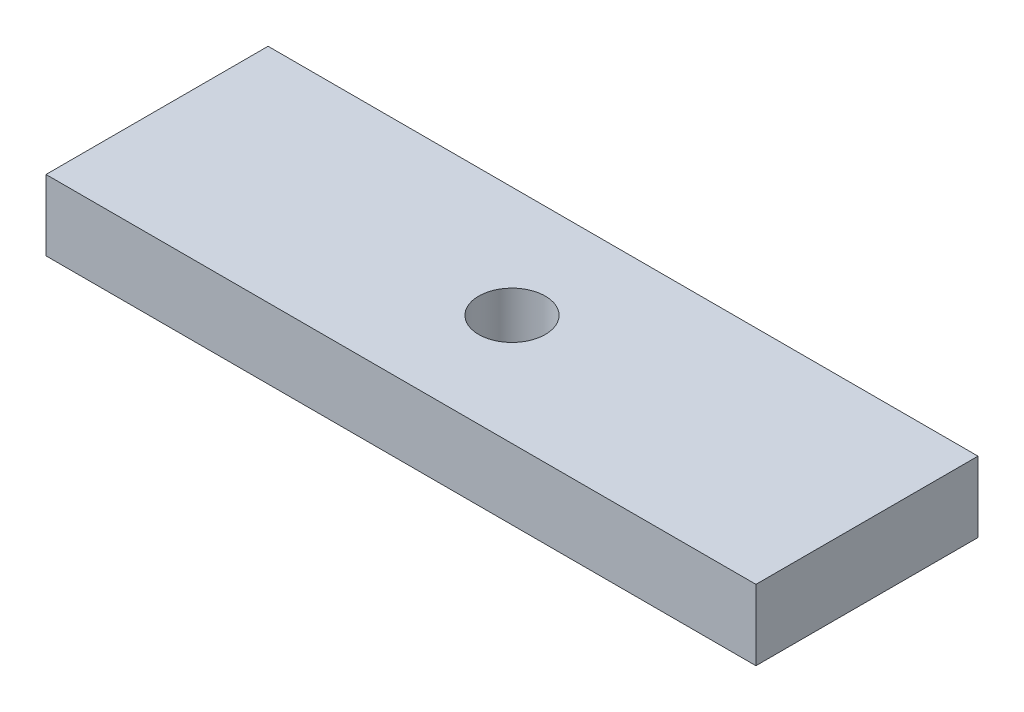
ISO-10303-21;
HEADER;
FILE_DESCRIPTION(('STEP AP214'),'2;1');
FILE_NAME('part.step','',(''),(''),'','','');
FILE_SCHEMA(('AUTOMOTIVE_DESIGN { 1 0 10303 214 1 1 1 1 }'));
ENDSEC;
DATA;
#1=APPLICATION_CONTEXT('core data for automotive mechanical design processes');
#2=APPLICATION_PROTOCOL_DEFINITION('international standard','automotive_design',2000,#1);
#3=PRODUCT_CONTEXT('',#1,'mechanical');
#4=PRODUCT('Part','Part','',(#3));
#5=PRODUCT_RELATED_PRODUCT_CATEGORY('part','',(#4));
#6=PRODUCT_DEFINITION_FORMATION('','',#4);
#7=PRODUCT_DEFINITION_CONTEXT('part definition',#1,'design');
#8=PRODUCT_DEFINITION('design','',#6,#7);
#9=PRODUCT_DEFINITION_SHAPE('','',#8);
#10=(LENGTH_UNIT() NAMED_UNIT(*) SI_UNIT(.MILLI.,.METRE.));
#11=(NAMED_UNIT(*) PLANE_ANGLE_UNIT() SI_UNIT($,.RADIAN.));
#12=(NAMED_UNIT(*) SI_UNIT($,.STERADIAN.) SOLID_ANGLE_UNIT());
#13=UNCERTAINTY_MEASURE_WITH_UNIT(LENGTH_MEASURE(1.E-05),#10,'distance_accuracy_value','');
#14=(GEOMETRIC_REPRESENTATION_CONTEXT(3) GLOBAL_UNCERTAINTY_ASSIGNED_CONTEXT((#13)) GLOBAL_UNIT_ASSIGNED_CONTEXT((#10,
#11,#12)) REPRESENTATION_CONTEXT('',''));
#15=CARTESIAN_POINT('',(0.,0.,0.));
#16=DIRECTION('',(0.,0.,1.));
#17=DIRECTION('',(1.,0.,0.));
#18=AXIS2_PLACEMENT_3D('',#15,#16,#17);
#19=CARTESIAN_POINT('',(0.,6.35,0.));
#20=DIRECTION('',(0.,1.,0.));
#21=DIRECTION('',(0.,0.,1.));
#22=AXIS2_PLACEMENT_3D('',#19,#20,#21);
#23=PLANE('',#22);
#24=DIRECTION('',(0.,0.,-1.));
#25=VECTOR('',#24,1.);
#26=CARTESIAN_POINT('',(31.97,6.35,-10.));
#27=LINE('',#26,#25);
#28=CARTESIAN_POINT('',(31.97,6.35,10.));
#29=VERTEX_POINT('',#28);
#30=CARTESIAN_POINT('',(31.97,6.35,-10.));
#31=VERTEX_POINT('',#30);
#32=EDGE_CURVE('E85',#29,#31,#27,.T.);
#33=ORIENTED_EDGE('',*,*,#32,.T.);
#34=DIRECTION('',(-1.,0.,0.));
#35=VECTOR('',#34,1.);
#36=CARTESIAN_POINT('',(-31.97,6.35,-10.));
#37=LINE('',#36,#35);
#38=CARTESIAN_POINT('',(-31.97,6.35,-10.));
#39=VERTEX_POINT('',#38);
#40=EDGE_CURVE('E80',#31,#39,#37,.T.);
#41=ORIENTED_EDGE('',*,*,#40,.T.);
#42=DIRECTION('',(0.,0.,1.));
#43=VECTOR('',#42,1.);
#44=CARTESIAN_POINT('',(-31.97,6.35,-10.));
#45=LINE('',#44,#43);
#46=CARTESIAN_POINT('',(-31.97,6.35,10.));
#47=VERTEX_POINT('',#46);
#48=EDGE_CURVE('E83',#39,#47,#45,.T.);
#49=ORIENTED_EDGE('',*,*,#48,.T.);
#50=DIRECTION('',(1.,0.,0.));
#51=VECTOR('',#50,1.);
#52=CARTESIAN_POINT('',(-31.97,6.35,10.));
#53=LINE('',#52,#51);
#54=EDGE_CURVE('E50',#47,#29,#53,.T.);
#55=ORIENTED_EDGE('',*,*,#54,.T.);
#56=EDGE_LOOP('',(#33,#41,#49,#55));
#57=FACE_BOUND('',#56,.T.);
#58=CARTESIAN_POINT('',(0.,6.35,0.));
#59=DIRECTION('',(0.,1.,0.));
#60=DIRECTION('',(0.,0.,1.));
#61=AXIS2_PLACEMENT_3D('',#58,#59,#60);
#62=CIRCLE('',#61,3.);
#63=CARTESIAN_POINT('',(0.,6.35,3.));
#64=VERTEX_POINT('',#63);
#65=EDGE_CURVE('E100',#64,#64,#62,.T.);
#66=ORIENTED_EDGE('',*,*,#65,.F.);
#67=EDGE_LOOP('',(#66));
#68=FACE_BOUND('',#67,.T.);
#69=ADVANCED_FACE('F33',(#57,#68),#23,.T.);
#70=CARTESIAN_POINT('',(0.,0.,0.));
#71=DIRECTION('',(0.,1.,0.));
#72=DIRECTION('',(0.,0.,1.));
#73=AXIS2_PLACEMENT_3D('',#70,#71,#72);
#74=PLANE('',#73);
#75=DIRECTION('',(0.,0.,-1.));
#76=VECTOR('',#75,1.);
#77=CARTESIAN_POINT('',(31.97,0.,-10.));
#78=LINE('',#77,#76);
#79=CARTESIAN_POINT('',(31.97,0.,10.));
#80=VERTEX_POINT('',#79);
#81=CARTESIAN_POINT('',(31.97,0.,-10.));
#82=VERTEX_POINT('',#81);
#83=EDGE_CURVE('E97',#80,#82,#78,.T.);
#84=ORIENTED_EDGE('',*,*,#83,.F.);
#85=DIRECTION('',(1.,0.,0.));
#86=VECTOR('',#85,1.);
#87=CARTESIAN_POINT('',(-31.97,0.,10.));
#88=LINE('',#87,#86);
#89=CARTESIAN_POINT('',(-31.97,0.,10.));
#90=VERTEX_POINT('',#89);
#91=EDGE_CURVE('E73',#90,#80,#88,.T.);
#92=ORIENTED_EDGE('',*,*,#91,.F.);
#93=DIRECTION('',(0.,0.,1.));
#94=VECTOR('',#93,1.);
#95=CARTESIAN_POINT('',(-31.97,0.,-10.));
#96=LINE('',#95,#94);
#97=CARTESIAN_POINT('',(-31.97,0.,-10.));
#98=VERTEX_POINT('',#97);
#99=EDGE_CURVE('E67',#98,#90,#96,.T.);
#100=ORIENTED_EDGE('',*,*,#99,.F.);
#101=DIRECTION('',(-1.,0.,0.));
#102=VECTOR('',#101,1.);
#103=CARTESIAN_POINT('',(-31.97,0.,-10.));
#104=LINE('',#103,#102);
#105=EDGE_CURVE('E89',#82,#98,#104,.T.);
#106=ORIENTED_EDGE('',*,*,#105,.F.);
#107=EDGE_LOOP('',(#84,#92,#100,#106));
#108=FACE_BOUND('',#107,.T.);
#109=CARTESIAN_POINT('',(0.,0.,0.));
#110=DIRECTION('',(0.,1.,0.));
#111=DIRECTION('',(0.,0.,1.));
#112=AXIS2_PLACEMENT_3D('',#109,#110,#111);
#113=CIRCLE('',#112,3.);
#114=CARTESIAN_POINT('',(0.,0.,3.));
#115=VERTEX_POINT('',#114);
#116=EDGE_CURVE('E112',#115,#115,#113,.T.);
#117=ORIENTED_EDGE('',*,*,#116,.T.);
#118=EDGE_LOOP('',(#117));
#119=FACE_BOUND('',#118,.T.);
#120=ADVANCED_FACE('F108',(#108,#119),#74,.F.);
#121=CARTESIAN_POINT('',(31.97,6.35,-10.));
#122=DIRECTION('',(-1.,0.,0.));
#123=DIRECTION('',(0.,0.,1.));
#124=AXIS2_PLACEMENT_3D('',#121,#122,#123);
#125=PLANE('',#124);
#126=ORIENTED_EDGE('',*,*,#83,.T.);
#127=DIRECTION('',(0.,-1.,0.));
#128=VECTOR('',#127,1.);
#129=CARTESIAN_POINT('',(31.97,6.35,-10.));
#130=LINE('',#129,#128);
#131=EDGE_CURVE('E11',#31,#82,#130,.T.);
#132=ORIENTED_EDGE('',*,*,#131,.F.);
#133=ORIENTED_EDGE('',*,*,#32,.F.);
#134=DIRECTION('',(0.,-1.,0.));
#135=VECTOR('',#134,1.);
#136=CARTESIAN_POINT('',(31.97,6.35,10.));
#137=LINE('',#136,#135);
#138=EDGE_CURVE('E93',#29,#80,#137,.T.);
#139=ORIENTED_EDGE('',*,*,#138,.T.);
#140=EDGE_LOOP('',(#126,#132,#133,#139));
#141=FACE_BOUND('',#140,.T.);
#142=ADVANCED_FACE('F35',(#141),#125,.F.);
#143=CARTESIAN_POINT('',(-31.97,6.35,-10.));
#144=DIRECTION('',(0.,0.,1.));
#145=DIRECTION('',(1.,0.,0.));
#146=AXIS2_PLACEMENT_3D('',#143,#144,#145);
#147=PLANE('',#146);
#148=ORIENTED_EDGE('',*,*,#105,.T.);
#149=DIRECTION('',(0.,-1.,0.));
#150=VECTOR('',#149,1.);
#151=CARTESIAN_POINT('',(-31.97,6.35,-10.));
#152=LINE('',#151,#150);
#153=EDGE_CURVE('E42',#39,#98,#152,.T.);
#154=ORIENTED_EDGE('',*,*,#153,.F.);
#155=ORIENTED_EDGE('',*,*,#40,.F.);
#156=ORIENTED_EDGE('',*,*,#131,.T.);
#157=EDGE_LOOP('',(#148,#154,#155,#156));
#158=FACE_BOUND('',#157,.T.);
#159=ADVANCED_FACE('F88',(#158),#147,.F.);
#160=CARTESIAN_POINT('',(-31.97,6.35,-10.));
#161=DIRECTION('',(1.,0.,0.));
#162=DIRECTION('',(0.,0.,-1.));
#163=AXIS2_PLACEMENT_3D('',#160,#161,#162);
#164=PLANE('',#163);
#165=ORIENTED_EDGE('',*,*,#99,.T.);
#166=DIRECTION('',(0.,-1.,0.));
#167=VECTOR('',#166,1.);
#168=CARTESIAN_POINT('',(-31.97,6.35,10.));
#169=LINE('',#168,#167);
#170=EDGE_CURVE('E90',#47,#90,#169,.T.);
#171=ORIENTED_EDGE('',*,*,#170,.F.);
#172=ORIENTED_EDGE('',*,*,#48,.F.);
#173=ORIENTED_EDGE('',*,*,#153,.T.);
#174=EDGE_LOOP('',(#165,#171,#172,#173));
#175=FACE_BOUND('',#174,.T.);
#176=ADVANCED_FACE('F91',(#175),#164,.F.);
#177=CARTESIAN_POINT('',(-31.97,6.35,10.));
#178=DIRECTION('',(0.,0.,-1.));
#179=DIRECTION('',(-1.,0.,0.));
#180=AXIS2_PLACEMENT_3D('',#177,#178,#179);
#181=PLANE('',#180);
#182=ORIENTED_EDGE('',*,*,#91,.T.);
#183=ORIENTED_EDGE('',*,*,#138,.F.);
#184=ORIENTED_EDGE('',*,*,#54,.F.);
#185=ORIENTED_EDGE('',*,*,#170,.T.);
#186=EDGE_LOOP('',(#182,#183,#184,#185));
#187=FACE_BOUND('',#186,.T.);
#188=ADVANCED_FACE('F105',(#187),#181,.F.);
#189=CARTESIAN_POINT('',(0.,6.35,0.));
#190=DIRECTION('',(0.,-1.,0.));
#191=DIRECTION('',(0.,0.,-1.));
#192=AXIS2_PLACEMENT_3D('',#189,#190,#191);
#193=CYLINDRICAL_SURFACE('',#192,3.);
#194=ORIENTED_EDGE('',*,*,#65,.T.);
#195=EDGE_LOOP('',(#194));
#196=FACE_BOUND('',#195,.T.);
#197=ORIENTED_EDGE('',*,*,#116,.F.);
#198=EDGE_LOOP('',(#197));
#199=FACE_BOUND('',#198,.T.);
#200=ADVANCED_FACE('F118',(#196,#199),#193,.F.);
#201=CLOSED_SHELL('',(#69,#120,#142,#159,#176,#188,#200));
#202=MANIFOLD_SOLID_BREP('B2',#201);
#203=ADVANCED_BREP_SHAPE_REPRESENTATION('',(#18,#202),#14);
#204=SHAPE_DEFINITION_REPRESENTATION(#9,#203);
ENDSEC;
END-ISO-10303-21;
